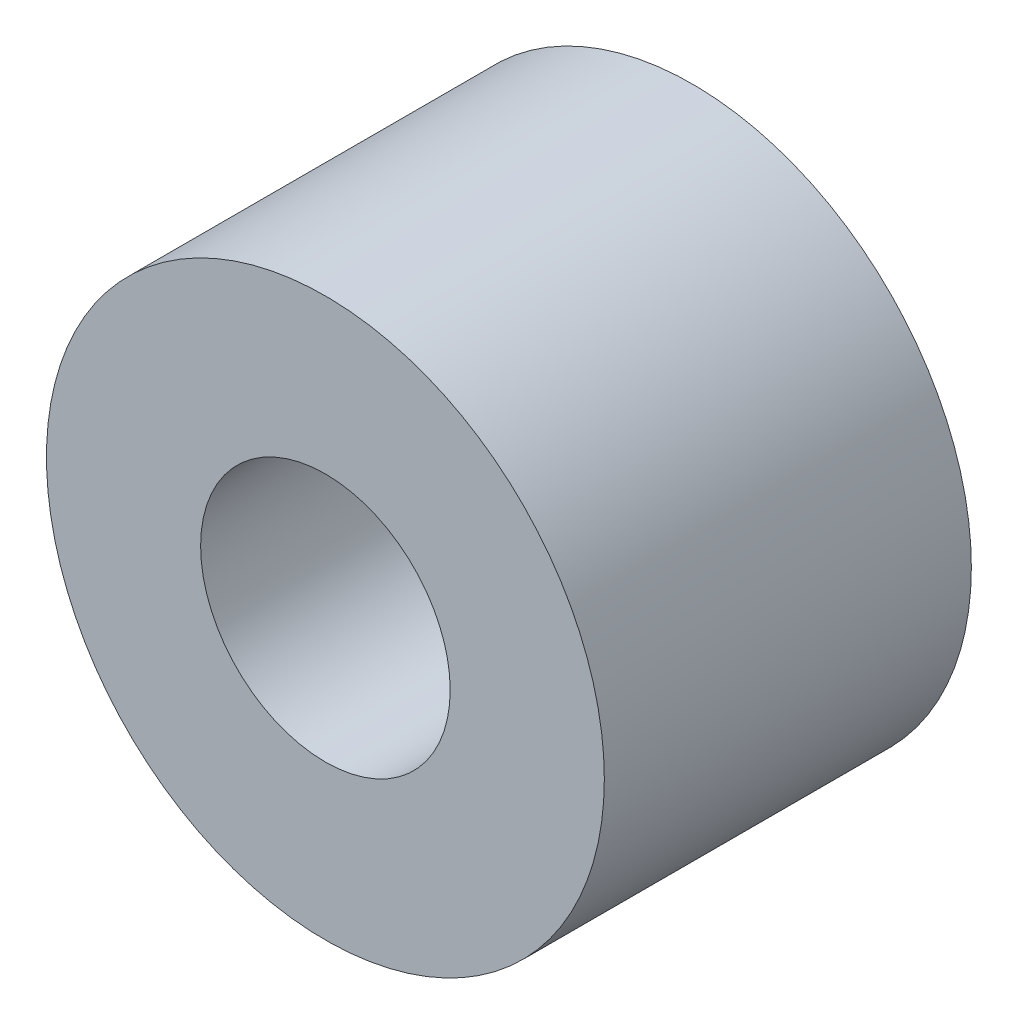
ISO-10303-21;
HEADER;
FILE_DESCRIPTION(('STEP AP214'),'2;1');
FILE_NAME('part.step','',(''),(''),'','','');
FILE_SCHEMA(('AUTOMOTIVE_DESIGN { 1 0 10303 214 1 1 1 1 }'));
ENDSEC;
DATA;
#1=APPLICATION_CONTEXT('core data for automotive mechanical design processes');
#2=APPLICATION_PROTOCOL_DEFINITION('international standard','automotive_design',2000,#1);
#3=PRODUCT_CONTEXT('',#1,'mechanical');
#4=PRODUCT('Part','Part','',(#3));
#5=PRODUCT_RELATED_PRODUCT_CATEGORY('part','',(#4));
#6=PRODUCT_DEFINITION_FORMATION('','',#4);
#7=PRODUCT_DEFINITION_CONTEXT('part definition',#1,'design');
#8=PRODUCT_DEFINITION('design','',#6,#7);
#9=PRODUCT_DEFINITION_SHAPE('','',#8);
#10=(LENGTH_UNIT() NAMED_UNIT(*) SI_UNIT(.MILLI.,.METRE.));
#11=(NAMED_UNIT(*) PLANE_ANGLE_UNIT() SI_UNIT($,.RADIAN.));
#12=(NAMED_UNIT(*) SI_UNIT($,.STERADIAN.) SOLID_ANGLE_UNIT());
#13=UNCERTAINTY_MEASURE_WITH_UNIT(LENGTH_MEASURE(1.E-05),#10,'distance_accuracy_value','');
#14=(GEOMETRIC_REPRESENTATION_CONTEXT(3) GLOBAL_UNCERTAINTY_ASSIGNED_CONTEXT((#13)) GLOBAL_UNIT_ASSIGNED_CONTEXT((#10,
#11,#12)) REPRESENTATION_CONTEXT('',''));
#15=CARTESIAN_POINT('',(0.,0.,0.));
#16=DIRECTION('',(0.,0.,1.));
#17=DIRECTION('',(1.,0.,0.));
#18=AXIS2_PLACEMENT_3D('',#15,#16,#17);
#19=CARTESIAN_POINT('',(0.,0.,25.));
#20=DIRECTION('',(0.,0.,1.));
#21=DIRECTION('',(1.,0.,0.));
#22=AXIS2_PLACEMENT_3D('',#19,#20,#21);
#23=PLANE('',#22);
#24=CARTESIAN_POINT('',(0.,0.,25.));
#25=DIRECTION('',(0.,0.,1.));
#26=DIRECTION('',(1.,0.,0.));
#27=AXIS2_PLACEMENT_3D('',#24,#25,#26);
#28=CIRCLE('',#27,19.);
#29=CARTESIAN_POINT('',(19.,0.,25.));
#30=VERTEX_POINT('',#29);
#31=EDGE_CURVE('E10',#30,#30,#28,.T.);
#32=ORIENTED_EDGE('',*,*,#31,.T.);
#33=EDGE_LOOP('',(#32));
#34=FACE_BOUND('',#33,.T.);
#35=CARTESIAN_POINT('',(0.,0.,25.));
#36=DIRECTION('',(0.,0.,1.));
#37=DIRECTION('',(1.,0.,0.));
#38=AXIS2_PLACEMENT_3D('',#35,#36,#37);
#39=CIRCLE('',#38,8.5);
#40=CARTESIAN_POINT('',(8.5,0.,25.));
#41=VERTEX_POINT('',#40);
#42=EDGE_CURVE('E41',#41,#41,#39,.T.);
#43=ORIENTED_EDGE('',*,*,#42,.F.);
#44=EDGE_LOOP('',(#43));
#45=FACE_BOUND('',#44,.T.);
#46=ADVANCED_FACE('F30',(#34,#45),#23,.T.);
#47=CARTESIAN_POINT('',(0.,0.,0.));
#48=DIRECTION('',(0.,0.,1.));
#49=DIRECTION('',(1.,0.,0.));
#50=AXIS2_PLACEMENT_3D('',#47,#48,#49);
#51=PLANE('',#50);
#52=CARTESIAN_POINT('',(0.,0.,0.));
#53=DIRECTION('',(0.,0.,1.));
#54=DIRECTION('',(1.,0.,0.));
#55=AXIS2_PLACEMENT_3D('',#52,#53,#54);
#56=CIRCLE('',#55,19.);
#57=CARTESIAN_POINT('',(19.,0.,0.));
#58=VERTEX_POINT('',#57);
#59=EDGE_CURVE('E34',#58,#58,#56,.T.);
#60=ORIENTED_EDGE('',*,*,#59,.F.);
#61=EDGE_LOOP('',(#60));
#62=FACE_BOUND('',#61,.T.);
#63=CARTESIAN_POINT('',(0.,0.,0.));
#64=DIRECTION('',(0.,0.,1.));
#65=DIRECTION('',(1.,0.,0.));
#66=AXIS2_PLACEMENT_3D('',#63,#64,#65);
#67=CIRCLE('',#66,8.5);
#68=CARTESIAN_POINT('',(8.5,0.,0.));
#69=VERTEX_POINT('',#68);
#70=EDGE_CURVE('E43',#69,#69,#67,.T.);
#71=ORIENTED_EDGE('',*,*,#70,.T.);
#72=EDGE_LOOP('',(#71));
#73=FACE_BOUND('',#72,.T.);
#74=ADVANCED_FACE('F53',(#62,#73),#51,.F.);
#75=CARTESIAN_POINT('',(0.,0.,25.));
#76=DIRECTION('',(0.,0.,-1.));
#77=DIRECTION('',(-1.,0.,0.));
#78=AXIS2_PLACEMENT_3D('',#75,#76,#77);
#79=CYLINDRICAL_SURFACE('',#78,19.);
#80=ORIENTED_EDGE('',*,*,#31,.F.);
#81=EDGE_LOOP('',(#80));
#82=FACE_BOUND('',#81,.T.);
#83=ORIENTED_EDGE('',*,*,#59,.T.);
#84=EDGE_LOOP('',(#83));
#85=FACE_BOUND('',#84,.T.);
#86=ADVANCED_FACE('F32',(#82,#85),#79,.T.);
#87=CARTESIAN_POINT('',(0.,0.,25.));
#88=DIRECTION('',(0.,0.,-1.));
#89=DIRECTION('',(-1.,0.,0.));
#90=AXIS2_PLACEMENT_3D('',#87,#88,#89);
#91=CYLINDRICAL_SURFACE('',#90,8.5);
#92=ORIENTED_EDGE('',*,*,#42,.T.);
#93=EDGE_LOOP('',(#92));
#94=FACE_BOUND('',#93,.T.);
#95=ORIENTED_EDGE('',*,*,#70,.F.);
#96=EDGE_LOOP('',(#95));
#97=FACE_BOUND('',#96,.T.);
#98=ADVANCED_FACE('F49',(#94,#97),#91,.F.);
#99=CLOSED_SHELL('',(#46,#74,#86,#98));
#100=MANIFOLD_SOLID_BREP('B2',#99);
#101=ADVANCED_BREP_SHAPE_REPRESENTATION('',(#18,#100),#14);
#102=SHAPE_DEFINITION_REPRESENTATION(#9,#101);
ENDSEC;
END-ISO-10303-21;
